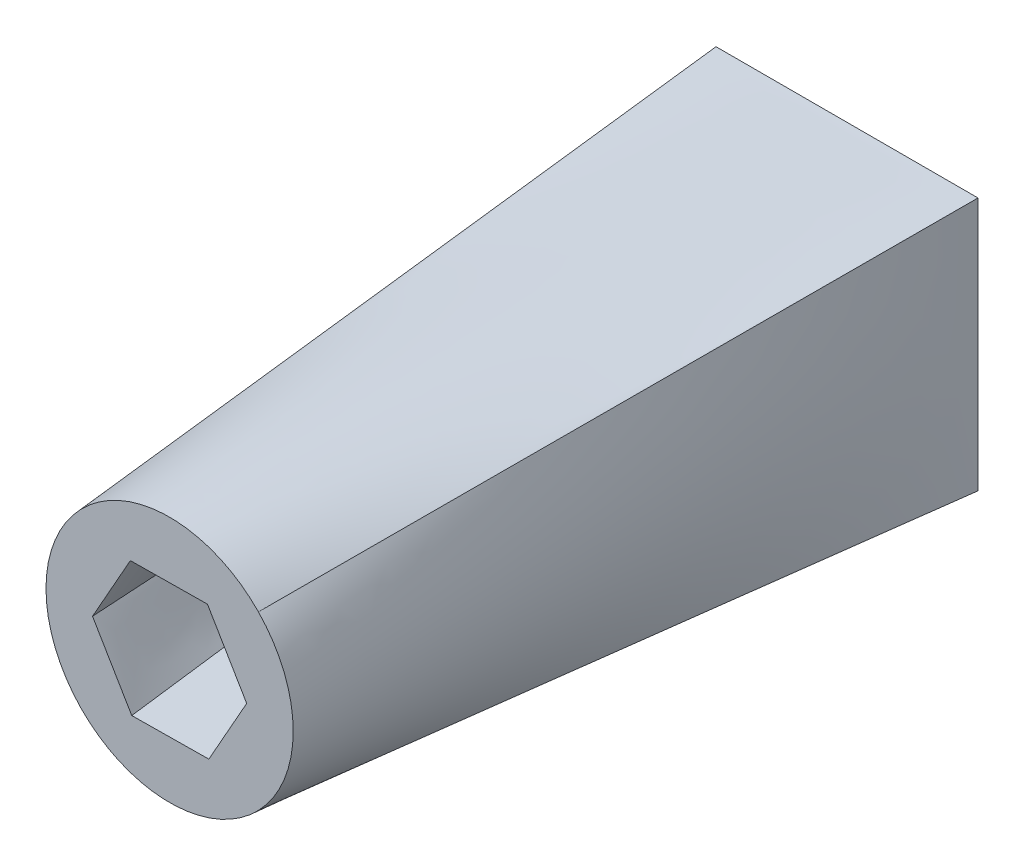
ISO-10303-21;
HEADER;
FILE_DESCRIPTION(('STEP AP214'),'2;1');
FILE_NAME('part.step','',(''),(''),'','','');
FILE_SCHEMA(('AUTOMOTIVE_DESIGN { 1 0 10303 214 1 1 1 1 }'));
ENDSEC;
DATA;
#1=APPLICATION_CONTEXT('core data for automotive mechanical design processes');
#2=APPLICATION_PROTOCOL_DEFINITION('international standard','automotive_design',2000,#1);
#3=PRODUCT_CONTEXT('',#1,'mechanical');
#4=PRODUCT('Part','Part','',(#3));
#5=PRODUCT_RELATED_PRODUCT_CATEGORY('part','',(#4));
#6=PRODUCT_DEFINITION_FORMATION('','',#4);
#7=PRODUCT_DEFINITION_CONTEXT('part definition',#1,'design');
#8=PRODUCT_DEFINITION('design','',#6,#7);
#9=PRODUCT_DEFINITION_SHAPE('','',#8);
#10=(LENGTH_UNIT() NAMED_UNIT(*) SI_UNIT(.MILLI.,.METRE.));
#11=(NAMED_UNIT(*) PLANE_ANGLE_UNIT() SI_UNIT($,.RADIAN.));
#12=(NAMED_UNIT(*) SI_UNIT($,.STERADIAN.) SOLID_ANGLE_UNIT());
#13=UNCERTAINTY_MEASURE_WITH_UNIT(LENGTH_MEASURE(1.E-05),#10,'distance_accuracy_value','');
#14=(GEOMETRIC_REPRESENTATION_CONTEXT(3) GLOBAL_UNCERTAINTY_ASSIGNED_CONTEXT((#13)) GLOBAL_UNIT_ASSIGNED_CONTEXT((#10,
#11,#12)) REPRESENTATION_CONTEXT('',''));
#15=CARTESIAN_POINT('',(0.,0.,0.));
#16=DIRECTION('',(0.,0.,1.));
#17=DIRECTION('',(1.,0.,0.));
#18=AXIS2_PLACEMENT_3D('',#15,#16,#17);
#19=CARTESIAN_POINT('',(0.,0.,200.));
#20=DIRECTION('',(0.,0.,1.));
#21=DIRECTION('',(1.,0.,0.));
#22=AXIS2_PLACEMENT_3D('',#19,#20,#21);
#23=PLANE('',#22);
#24=DIRECTION('',(-0.490964430670506,-0.871179618572649,0.));
#25=VECTOR('',#24,1.);
#26=CARTESIAN_POINT('',(-11.5843119242048,19.5911157541689,200.));
#27=LINE('',#26,#25);
#28=CARTESIAN_POINT('',(-11.5843119242048,19.5911157541689,200.));
#29=VERTEX_POINT('',#28);
#30=CARTESIAN_POINT('',(-22.7585598936942,-0.236750534639941,200.));
#31=VERTEX_POINT('',#30);
#32=EDGE_CURVE('E95',#29,#31,#27,.T.);
#33=ORIENTED_EDGE('',*,*,#32,.F.);
#34=DIRECTION('',(-0.999945896278404,-0.0104021399711025,0.));
#35=VECTOR('',#34,1.);
#36=CARTESIAN_POINT('',(11.1742479694894,19.8278662888088,200.));
#37=LINE('',#36,#35);
#38=CARTESIAN_POINT('',(11.1742479694894,19.8278662888088,200.));
#39=VERTEX_POINT('',#38);
#40=EDGE_CURVE('E193',#39,#29,#37,.T.);
#41=ORIENTED_EDGE('',*,*,#40,.F.);
#42=DIRECTION('',(-0.508981465607899,0.860777478601546,0.));
#43=VECTOR('',#42,1.);
#44=CARTESIAN_POINT('',(22.7585598936942,0.236750534639953,200.));
#45=LINE('',#44,#43);
#46=CARTESIAN_POINT('',(22.7585598936942,0.236750534639953,200.));
#47=VERTEX_POINT('',#46);
#48=EDGE_CURVE('E476',#47,#39,#45,.T.);
#49=ORIENTED_EDGE('',*,*,#48,.F.);
#50=DIRECTION('',(0.490964430670506,0.871179618572649,0.));
#51=VECTOR('',#50,1.);
#52=CARTESIAN_POINT('',(11.5843119242048,-19.5911157541689,200.));
#53=LINE('',#52,#51);
#54=CARTESIAN_POINT('',(11.5843119242048,-19.5911157541689,200.));
#55=VERTEX_POINT('',#54);
#56=EDGE_CURVE('E467',#55,#47,#53,.T.);
#57=ORIENTED_EDGE('',*,*,#56,.F.);
#58=DIRECTION('',(0.999945896278405,0.0104021399711027,0.));
#59=VECTOR('',#58,1.);
#60=CARTESIAN_POINT('',(-11.1742479694893,-19.8278662888088,200.));
#61=LINE('',#60,#59);
#62=CARTESIAN_POINT('',(-11.1742479694893,-19.8278662888088,200.));
#63=VERTEX_POINT('',#62);
#64=EDGE_CURVE('E199',#63,#55,#61,.T.);
#65=ORIENTED_EDGE('',*,*,#64,.F.);
#66=DIRECTION('',(0.508981465607898,-0.860777478601546,0.));
#67=VECTOR('',#66,1.);
#68=CARTESIAN_POINT('',(-22.7585598936942,-0.236750534639941,200.));
#69=LINE('',#68,#67);
#70=EDGE_CURVE('E173',#31,#63,#69,.T.);
#71=ORIENTED_EDGE('',*,*,#70,.F.);
#72=EDGE_LOOP('',(#33,#41,#49,#57,#65,#71));
#73=FACE_BOUND('',#72,.T.);
#74=CARTESIAN_POINT('',(0.,0.,200.));
#75=DIRECTION('',(0.,0.,1.));
#76=DIRECTION('',(1.,0.,0.));
#77=AXIS2_PLACEMENT_3D('',#74,#75,#76);
#78=CIRCLE('',#77,36.4946815327442);
#79=CARTESIAN_POINT('',(26.2199759183537,25.384535509191,200.));
#80=VERTEX_POINT('',#79);
#81=CARTESIAN_POINT('',(-26.2199759183537,25.3845355091909,200.));
#82=VERTEX_POINT('',#81);
#83=EDGE_CURVE('E12',#80,#82,#78,.T.);
#84=ORIENTED_EDGE('',*,*,#83,.T.);
#85=CARTESIAN_POINT('',(-26.2199759183537,-25.3845355091909,200.));
#86=VERTEX_POINT('',#85);
#87=EDGE_CURVE('E102',#82,#86,#78,.T.);
#88=ORIENTED_EDGE('',*,*,#87,.T.);
#89=CARTESIAN_POINT('',(26.2199759183537,-25.3845355091909,200.));
#90=VERTEX_POINT('',#89);
#91=EDGE_CURVE('E322',#86,#90,#78,.T.);
#92=ORIENTED_EDGE('',*,*,#91,.T.);
#93=EDGE_CURVE('E339',#90,#80,#78,.T.);
#94=ORIENTED_EDGE('',*,*,#93,.T.);
#95=EDGE_LOOP('',(#84,#88,#92,#94));
#96=FACE_BOUND('',#95,.T.);
#97=ADVANCED_FACE('F91',(#73,#96),#23,.T.);
#98=CARTESIAN_POINT('',(0.,0.,0.));
#99=DIRECTION('',(0.,0.,1.));
#100=DIRECTION('',(1.,0.,0.));
#101=AXIS2_PLACEMENT_3D('',#98,#99,#100);
#102=PLANE('',#101);
#103=DIRECTION('',(1.,0.,0.));
#104=VECTOR('',#103,1.);
#105=CARTESIAN_POINT('',(25.4400575590377,8.80180562868562,0.));
#106=LINE('',#105,#104);
#107=CARTESIAN_POINT('',(-0.397500899359964,8.80180562868562,0.));
#108=VERTEX_POINT('',#107);
#109=CARTESIAN_POINT('',(25.4400575590377,8.80180562868562,0.));
#110=VERTEX_POINT('',#109);
#111=EDGE_CURVE('E255',#108,#110,#106,.T.);
#112=ORIENTED_EDGE('',*,*,#111,.F.);
#113=CARTESIAN_POINT('',(-26.2350593577576,8.80180562868562,0.));
#114=VERTEX_POINT('',#113);
#115=EDGE_CURVE('E448',#114,#108,#106,.T.);
#116=ORIENTED_EDGE('',*,*,#115,.F.);
#117=CARTESIAN_POINT('',(-26.2350593577576,0.,0.));
#118=DIRECTION('',(0.,0.,-1.));
#119=DIRECTION('',(-1.,0.,0.));
#120=AXIS2_PLACEMENT_3D('',#117,#118,#119);
#121=CIRCLE('',#120,8.80180562868562);
#122=CARTESIAN_POINT('',(-26.2350593577576,-8.80180562868562,0.));
#123=VERTEX_POINT('',#122);
#124=EDGE_CURVE('E177',#123,#114,#121,.T.);
#125=ORIENTED_EDGE('',*,*,#124,.F.);
#126=DIRECTION('',(-1.,0.,0.));
#127=VECTOR('',#126,1.);
#128=CARTESIAN_POINT('',(25.4400575590377,-8.80180562868562,0.));
#129=LINE('',#128,#127);
#130=CARTESIAN_POINT('',(-0.397500899359988,-8.80180562868562,0.));
#131=VERTEX_POINT('',#130);
#132=EDGE_CURVE('E228',#131,#123,#129,.T.);
#133=ORIENTED_EDGE('',*,*,#132,.F.);
#134=CARTESIAN_POINT('',(25.4400575590377,-8.80180562868562,0.));
#135=VERTEX_POINT('',#134);
#136=EDGE_CURVE('E237',#135,#131,#129,.T.);
#137=ORIENTED_EDGE('',*,*,#136,.F.);
#138=CARTESIAN_POINT('',(25.4400575590377,0.,0.));
#139=DIRECTION('',(0.,0.,-1.));
#140=DIRECTION('',(-1.,0.,0.));
#141=AXIS2_PLACEMENT_3D('',#138,#139,#140);
#142=CIRCLE('',#141,8.80180562868562);
#143=EDGE_CURVE('E238',#110,#135,#142,.T.);
#144=ORIENTED_EDGE('',*,*,#143,.F.);
#145=EDGE_LOOP('',(#112,#116,#125,#133,#137,#144));
#146=FACE_BOUND('',#145,.T.);
#147=DIRECTION('',(0.,1.,0.));
#148=VECTOR('',#147,1.);
#149=CARTESIAN_POINT('',(38.674883286648,37.4425953387898,0.));
#150=LINE('',#149,#148);
#151=CARTESIAN_POINT('',(38.674883286648,-37.4425953387898,0.));
#152=VERTEX_POINT('',#151);
#153=CARTESIAN_POINT('',(38.674883286648,37.4425953387898,0.));
#154=VERTEX_POINT('',#153);
#155=EDGE_CURVE('E635',#152,#154,#150,.T.);
#156=ORIENTED_EDGE('',*,*,#155,.F.);
#157=DIRECTION('',(1.,0.,0.));
#158=VECTOR('',#157,1.);
#159=CARTESIAN_POINT('',(-38.674883286648,-37.4425953387898,0.));
#160=LINE('',#159,#158);
#161=CARTESIAN_POINT('',(-38.674883286648,-37.4425953387898,0.));
#162=VERTEX_POINT('',#161);
#163=EDGE_CURVE('E638',#162,#152,#160,.T.);
#164=ORIENTED_EDGE('',*,*,#163,.F.);
#165=DIRECTION('',(0.,-1.,0.));
#166=VECTOR('',#165,1.);
#167=CARTESIAN_POINT('',(-38.674883286648,37.4425953387898,0.));
#168=LINE('',#167,#166);
#169=CARTESIAN_POINT('',(-38.674883286648,37.4425953387898,0.));
#170=VERTEX_POINT('',#169);
#171=EDGE_CURVE('E640',#170,#162,#168,.T.);
#172=ORIENTED_EDGE('',*,*,#171,.F.);
#173=DIRECTION('',(-1.,0.,0.));
#174=VECTOR('',#173,1.);
#175=CARTESIAN_POINT('',(-38.674883286648,37.4425953387898,0.));
#176=LINE('',#175,#174);
#177=EDGE_CURVE('E271',#154,#170,#176,.T.);
#178=ORIENTED_EDGE('',*,*,#177,.F.);
#179=EDGE_LOOP('',(#156,#164,#172,#178));
#180=FACE_BOUND('',#179,.T.);
#181=ADVANCED_FACE('F382',(#146,#180),#102,.F.);
#182=CARTESIAN_POINT('',(-38.674883286648,37.4425953387898,0.));
#183=CARTESIAN_POINT('',(-26.2199759183537,25.3845355091909,200.));
#184=CARTESIAN_POINT('',(-38.674883286648,34.3223790605573,0.));
#185=CARTESIAN_POINT('',(-27.6913653006651,23.8647206535377,200.));
#186=CARTESIAN_POINT('',(-38.674883286648,31.2021627823248,0.));
#187=CARTESIAN_POINT('',(-29.082713953847,22.1616556356841,200.));
#188=CARTESIAN_POINT('',(-38.674883286648,24.9617302258599,0.));
#189=CARTESIAN_POINT('',(-31.5890003174961,18.4140785915877,200.));
#190=CARTESIAN_POINT('',(-38.674883286648,21.8415139476274,0.));
#191=CARTESIAN_POINT('',(-32.7031713151876,16.3694213020386,200.));
#192=CARTESIAN_POINT('',(-38.674883286648,15.6010813911625,0.));
#193=CARTESIAN_POINT('',(-34.5424270388589,12.0114987449215,200.));
#194=CARTESIAN_POINT('',(-38.674883286648,12.48086511293,0.));
#195=CARTESIAN_POINT('',(-35.2666769915234,9.69856716025703,200.));
#196=CARTESIAN_POINT('',(-38.674883286648,6.24043255646502,0.));
#197=CARTESIAN_POINT('',(-36.2430818637852,4.92338582699144,200.));
#198=CARTESIAN_POINT('',(-38.674883286648,3.12021627823253,0.));
#199=CARTESIAN_POINT('',(-36.4946815327442,2.46194583774648,200.));
#200=CARTESIAN_POINT('',(-38.674883286648,-3.12021627823244,0.));
#201=CARTESIAN_POINT('',(-36.4946815327442,-2.46194583774648,200.));
#202=CARTESIAN_POINT('',(-38.674883286648,-6.24043255646492,0.));
#203=CARTESIAN_POINT('',(-36.2430818637852,-4.92338582699143,200.));
#204=CARTESIAN_POINT('',(-38.674883286648,-12.4808651129299,0.));
#205=CARTESIAN_POINT('',(-35.2666769915234,-9.69856716025703,200.));
#206=CARTESIAN_POINT('',(-38.674883286648,-15.6010813911624,0.));
#207=CARTESIAN_POINT('',(-34.5424270388589,-12.0114987449215,200.));
#208=CARTESIAN_POINT('',(-38.674883286648,-21.8415139476273,0.));
#209=CARTESIAN_POINT('',(-32.7031713151876,-16.3694213020386,200.));
#210=CARTESIAN_POINT('',(-38.674883286648,-24.9617302258598,0.));
#211=CARTESIAN_POINT('',(-31.5890003174961,-18.4140785915877,200.));
#212=CARTESIAN_POINT('',(-38.674883286648,-31.2021627823248,0.));
#213=CARTESIAN_POINT('',(-29.082713953847,-22.1616556356841,200.));
#214=CARTESIAN_POINT('',(-38.674883286648,-34.3223790605573,0.));
#215=CARTESIAN_POINT('',(-27.6913653006651,-23.8647206535377,200.));
#216=CARTESIAN_POINT('',(-38.674883286648,-37.4425953387898,0.));
#217=CARTESIAN_POINT('',(-26.2199759183537,-25.3845355091909,200.));
#218=B_SPLINE_SURFACE_WITH_KNOTS('',3,1,((#182,#183),(#184,#185),(#186,#187),(#188,#189),(#190,
#191),(#192,#193),(#194,#195),(#196,#197),(#198,#199),(#200,#201),(#202,#203),(#204,#205),(#206,
#207),(#208,#209),(#210,#211),(#212,#213),(#214,#215),(#216,#217)),.UNSPECIFIED.,.F.,.F.,.F.,(4,
2,2,2,2,2,2,2,4),(2,2),(0.,0.125,0.25,0.375,0.5,0.625,0.75,0.875,1.),(0.,1.),.UNSPECIFIED.);
#219=DIRECTION('',(0.0620419113328122,0.0600650857266208,0.996264516438694));
#220=VECTOR('',#219,1.);
#221=CARTESIAN_POINT('',(-32.4474296025008,-31.4135654239904,100.));
#222=LINE('',#221,#220);
#223=EDGE_CURVE('E646',#162,#86,#222,.T.);
#224=DIRECTION('',(-0.0620419113328122,0.0600650857266208,-0.996264516438694));
#225=VECTOR('',#224,1.);
#226=CARTESIAN_POINT('',(-32.4474296025008,31.4135654239904,100.));
#227=LINE('',#226,#225);
#228=EDGE_CURVE('E643',#82,#170,#227,.T.);
#229=ORIENTED_EDGE('',*,*,#171,.T.);
#230=ORIENTED_EDGE('',*,*,#223,.T.);
#231=ORIENTED_EDGE('',*,*,#87,.F.);
#232=ORIENTED_EDGE('',*,*,#228,.T.);
#233=EDGE_LOOP('',(#229,#230,#231,#232));
#234=FACE_BOUND('',#233,.T.);
#235=ADVANCED_FACE('F391',(#234),#218,.T.);
#236=CARTESIAN_POINT('',(-38.674883286648,-37.4425953387898,0.));
#237=CARTESIAN_POINT('',(-26.2199759183537,-25.3845355091909,200.));
#238=CARTESIAN_POINT('',(-35.451976346094,-37.4425953387898,0.));
#239=CARTESIAN_POINT('',(-24.7001610627005,-26.9543695879416,200.));
#240=CARTESIAN_POINT('',(-32.22906940554,-37.4425953387898,0.));
#241=CARTESIAN_POINT('',(-22.9794220376688,-28.4479823663771,200.));
#242=CARTESIAN_POINT('',(-25.783255524432,-37.4425953387898,0.));
#243=CARTESIAN_POINT('',(-19.1565661839337,-31.1507224626262,200.));
#244=CARTESIAN_POINT('',(-22.560348583878,-37.4425953387898,0.));
#245=CARTESIAN_POINT('',(-17.0541999472398,-32.3589261828028,200.));
#246=CARTESIAN_POINT('',(-16.11453470277,-37.4425953387898,0.));
#247=CARTESIAN_POINT('',(-12.5448633657296,-34.3594563792807,200.));
#248=CARTESIAN_POINT('',(-12.891627762216,-37.4425953387898,0.));
#249=CARTESIAN_POINT('',(-10.1382512066798,-35.1507259768581,200.));
#250=CARTESIAN_POINT('',(-6.44581388110797,-37.4425953387898,0.));
#251=CARTESIAN_POINT('',(-5.15397511670574,-36.2186997934256,200.));
#252=CARTESIAN_POINT('',(-3.22290694055397,-37.4425953387898,0.));
#253=CARTESIAN_POINT('',(-2.57730494092512,-36.4946815327442,200.));
#254=CARTESIAN_POINT('',(3.22290694055402,-37.4425953387898,0.));
#255=CARTESIAN_POINT('',(2.57730494092509,-36.4946815327442,200.));
#256=CARTESIAN_POINT('',(6.44581388110802,-37.4425953387898,0.));
#257=CARTESIAN_POINT('',(5.15397511670571,-36.2186997934257,200.));
#258=CARTESIAN_POINT('',(12.891627762216,-37.4425953387898,0.));
#259=CARTESIAN_POINT('',(10.1382512066797,-35.1507259768581,200.));
#260=CARTESIAN_POINT('',(16.11453470277,-37.4425953387898,0.));
#261=CARTESIAN_POINT('',(12.5448633657296,-34.3594563792807,200.));
#262=CARTESIAN_POINT('',(22.560348583878,-37.4425953387898,0.));
#263=CARTESIAN_POINT('',(17.0541999472397,-32.3589261828028,200.));
#264=CARTESIAN_POINT('',(25.783255524432,-37.4425953387898,0.));
#265=CARTESIAN_POINT('',(19.1565661839337,-31.1507224626262,200.));
#266=CARTESIAN_POINT('',(32.22906940554,-37.4425953387898,0.));
#267=CARTESIAN_POINT('',(22.9794220376687,-28.4479823663771,200.));
#268=CARTESIAN_POINT('',(35.451976346094,-37.4425953387898,0.));
#269=CARTESIAN_POINT('',(24.7001610627004,-26.9543695879416,200.));
#270=CARTESIAN_POINT('',(38.674883286648,-37.4425953387898,0.));
#271=CARTESIAN_POINT('',(26.2199759183537,-25.3845355091909,200.));
#272=B_SPLINE_SURFACE_WITH_KNOTS('',3,1,((#236,#237),(#238,#239),(#240,#241),(#242,#243),(#244,
#245),(#246,#247),(#248,#249),(#250,#251),(#252,#253),(#254,#255),(#256,#257),(#258,#259),(#260,
#261),(#262,#263),(#264,#265),(#266,#267),(#268,#269),(#270,#271)),.UNSPECIFIED.,.F.,.F.,.F.,(4,
2,2,2,2,2,2,2,4),(2,2),(0.,0.125,0.25,0.375,0.5,0.625,0.75,0.875,1.),(0.,1.),.UNSPECIFIED.);
#273=DIRECTION('',(-0.0620419113328122,0.0600650857266208,0.996264516438694));
#274=VECTOR('',#273,1.);
#275=CARTESIAN_POINT('',(32.4474296025008,-31.4135654239904,100.));
#276=LINE('',#275,#274);
#277=EDGE_CURVE('E649',#152,#90,#276,.T.);
#278=ORIENTED_EDGE('',*,*,#163,.T.);
#279=ORIENTED_EDGE('',*,*,#277,.T.);
#280=ORIENTED_EDGE('',*,*,#91,.F.);
#281=ORIENTED_EDGE('',*,*,#223,.F.);
#282=EDGE_LOOP('',(#278,#279,#280,#281));
#283=FACE_BOUND('',#282,.T.);
#284=ADVANCED_FACE('F291',(#283),#272,.T.);
#285=CARTESIAN_POINT('',(38.674883286648,37.4425953387898,0.));
#286=CARTESIAN_POINT('',(26.2199759183537,25.3845355091909,200.));
#287=CARTESIAN_POINT('',(35.451976346094,37.4425953387898,0.));
#288=CARTESIAN_POINT('',(24.7001610627005,26.9543695879416,200.));
#289=CARTESIAN_POINT('',(32.22906940554,37.4425953387898,0.));
#290=CARTESIAN_POINT('',(22.9794220376688,28.4479823663771,200.));
#291=CARTESIAN_POINT('',(25.783255524432,37.4425953387898,0.));
#292=CARTESIAN_POINT('',(19.1565661839337,31.1507224626262,200.));
#293=CARTESIAN_POINT('',(22.560348583878,37.4425953387898,0.));
#294=CARTESIAN_POINT('',(17.0541999472398,32.3589261828028,200.));
#295=CARTESIAN_POINT('',(16.11453470277,37.4425953387898,0.));
#296=CARTESIAN_POINT('',(12.5448633657296,34.3594563792807,200.));
#297=CARTESIAN_POINT('',(12.891627762216,37.4425953387898,0.));
#298=CARTESIAN_POINT('',(10.1382512066797,35.1507259768581,200.));
#299=CARTESIAN_POINT('',(6.44581388110797,37.4425953387898,0.));
#300=CARTESIAN_POINT('',(5.15397511670572,36.2186997934257,200.));
#301=CARTESIAN_POINT('',(3.22290694055398,37.4425953387898,0.));
#302=CARTESIAN_POINT('',(2.57730494092511,36.4946815327442,200.));
#303=CARTESIAN_POINT('',(-3.22290694055402,37.4425953387898,0.));
#304=CARTESIAN_POINT('',(-2.57730494092512,36.4946815327442,200.));
#305=CARTESIAN_POINT('',(-6.44581388110802,37.4425953387898,0.));
#306=CARTESIAN_POINT('',(-5.15397511670573,36.2186997934257,200.));
#307=CARTESIAN_POINT('',(-12.891627762216,37.4425953387898,0.));
#308=CARTESIAN_POINT('',(-10.1382512066797,35.1507259768581,200.));
#309=CARTESIAN_POINT('',(-16.11453470277,37.4425953387898,0.));
#310=CARTESIAN_POINT('',(-12.5448633657296,34.3594563792807,200.));
#311=CARTESIAN_POINT('',(-22.560348583878,37.4425953387898,0.));
#312=CARTESIAN_POINT('',(-17.0541999472398,32.3589261828028,200.));
#313=CARTESIAN_POINT('',(-25.783255524432,37.4425953387898,0.));
#314=CARTESIAN_POINT('',(-19.1565661839337,31.1507224626262,200.));
#315=CARTESIAN_POINT('',(-32.22906940554,37.4425953387898,0.));
#316=CARTESIAN_POINT('',(-22.9794220376688,28.4479823663771,200.));
#317=CARTESIAN_POINT('',(-35.451976346094,37.4425953387898,0.));
#318=CARTESIAN_POINT('',(-24.7001610627005,26.9543695879416,200.));
#319=CARTESIAN_POINT('',(-38.674883286648,37.4425953387898,0.));
#320=CARTESIAN_POINT('',(-26.2199759183537,25.3845355091909,200.));
#321=B_SPLINE_SURFACE_WITH_KNOTS('',3,1,((#285,#286),(#287,#288),(#289,#290),(#291,#292),(#293,
#294),(#295,#296),(#297,#298),(#299,#300),(#301,#302),(#303,#304),(#305,#306),(#307,#308),(#309,
#310),(#311,#312),(#313,#314),(#315,#316),(#317,#318),(#319,#320)),.UNSPECIFIED.,.F.,.F.,.F.,(4,
2,2,2,2,2,2,2,4),(2,2),(0.,0.125,0.25,0.375,0.5,0.625,0.75,0.875,1.),(0.,1.),.UNSPECIFIED.);
#322=DIRECTION('',(-0.0620419113328122,-0.0600650857266207,0.996264516438694));
#323=VECTOR('',#322,1.);
#324=CARTESIAN_POINT('',(32.4474296025008,31.4135654239904,100.));
#325=LINE('',#324,#323);
#326=EDGE_CURVE('E277',#154,#80,#325,.T.);
#327=ORIENTED_EDGE('',*,*,#177,.T.);
#328=ORIENTED_EDGE('',*,*,#228,.F.);
#329=ORIENTED_EDGE('',*,*,#83,.F.);
#330=ORIENTED_EDGE('',*,*,#326,.F.);
#331=EDGE_LOOP('',(#327,#328,#329,#330));
#332=FACE_BOUND('',#331,.T.);
#333=ADVANCED_FACE('F279',(#332),#321,.T.);
#334=CARTESIAN_POINT('',(38.674883286648,-37.4425953387898,0.));
#335=CARTESIAN_POINT('',(26.2199759183537,-25.384535509191,200.));
#336=CARTESIAN_POINT('',(38.674883286648,-34.3223790605573,0.));
#337=CARTESIAN_POINT('',(27.6913653006651,-23.8647206535377,200.));
#338=CARTESIAN_POINT('',(38.674883286648,-31.2021627823249,0.));
#339=CARTESIAN_POINT('',(29.082713953847,-22.1616556356841,200.));
#340=CARTESIAN_POINT('',(38.674883286648,-24.9617302258599,0.));
#341=CARTESIAN_POINT('',(31.5890003174961,-18.4140785915877,200.));
#342=CARTESIAN_POINT('',(38.674883286648,-21.8415139476274,0.));
#343=CARTESIAN_POINT('',(32.7031713151876,-16.3694213020386,200.));
#344=CARTESIAN_POINT('',(38.674883286648,-15.6010813911625,0.));
#345=CARTESIAN_POINT('',(34.5424270388589,-12.0114987449216,200.));
#346=CARTESIAN_POINT('',(38.674883286648,-12.48086511293,0.));
#347=CARTESIAN_POINT('',(35.2666769915234,-9.69856716025705,200.));
#348=CARTESIAN_POINT('',(38.674883286648,-6.24043255646501,0.));
#349=CARTESIAN_POINT('',(36.2430818637852,-4.92338582699145,200.));
#350=CARTESIAN_POINT('',(38.674883286648,-3.12021627823253,0.));
#351=CARTESIAN_POINT('',(36.4946815327442,-2.46194583774649,200.));
#352=CARTESIAN_POINT('',(38.674883286648,3.12021627823244,0.));
#353=CARTESIAN_POINT('',(36.4946815327442,2.46194583774648,200.));
#354=CARTESIAN_POINT('',(38.674883286648,6.24043255646493,0.));
#355=CARTESIAN_POINT('',(36.2430818637853,4.92338582699144,200.));
#356=CARTESIAN_POINT('',(38.674883286648,12.4808651129299,0.));
#357=CARTESIAN_POINT('',(35.2666769915234,9.69856716025704,200.));
#358=CARTESIAN_POINT('',(38.674883286648,15.6010813911624,0.));
#359=CARTESIAN_POINT('',(34.5424270388589,12.0114987449216,200.));
#360=CARTESIAN_POINT('',(38.674883286648,21.8415139476274,0.));
#361=CARTESIAN_POINT('',(32.7031713151876,16.3694213020386,200.));
#362=CARTESIAN_POINT('',(38.674883286648,24.9617302258598,0.));
#363=CARTESIAN_POINT('',(31.5890003174961,18.4140785915877,200.));
#364=CARTESIAN_POINT('',(38.674883286648,31.2021627823248,0.));
#365=CARTESIAN_POINT('',(29.082713953847,22.1616556356841,200.));
#366=CARTESIAN_POINT('',(38.674883286648,34.3223790605573,0.));
#367=CARTESIAN_POINT('',(27.6913653006651,23.8647206535377,200.));
#368=CARTESIAN_POINT('',(38.674883286648,37.4425953387898,0.));
#369=CARTESIAN_POINT('',(26.2199759183537,25.384535509191,200.));
#370=B_SPLINE_SURFACE_WITH_KNOTS('',3,1,((#334,#335),(#336,#337),(#338,#339),(#340,#341),(#342,
#343),(#344,#345),(#346,#347),(#348,#349),(#350,#351),(#352,#353),(#354,#355),(#356,#357),(#358,
#359),(#360,#361),(#362,#363),(#364,#365),(#366,#367),(#368,#369)),.UNSPECIFIED.,.F.,.F.,.F.,(4,
2,2,2,2,2,2,2,4),(2,2),(0.,0.125,0.25,0.375,0.5,0.625,0.75,0.875,1.),(0.,1.),.UNSPECIFIED.);
#371=ORIENTED_EDGE('',*,*,#155,.T.);
#372=ORIENTED_EDGE('',*,*,#326,.T.);
#373=ORIENTED_EDGE('',*,*,#93,.F.);
#374=ORIENTED_EDGE('',*,*,#277,.F.);
#375=EDGE_LOOP('',(#371,#372,#373,#374));
#376=FACE_BOUND('',#375,.T.);
#377=ADVANCED_FACE('F290',(#376),#370,.T.);
#378=CARTESIAN_POINT('',(-22.7585598936942,-0.236750534639941,200.));
#379=CARTESIAN_POINT('',(-26.2350593577576,8.80180562868562,0.));
#380=CARTESIAN_POINT('',(-20.8961852321126,3.06789384682819,200.));
#381=CARTESIAN_POINT('',(-21.9287996146914,8.80180562868562,0.));
#382=CARTESIAN_POINT('',(-19.0338105705311,6.37253822829633,200.));
#383=CARTESIAN_POINT('',(-17.6225398716251,8.80180562868562,0.));
#384=CARTESIAN_POINT('',(-15.3090612473679,12.9818269912326,200.));
#385=CARTESIAN_POINT('',(-9.01002038549252,8.80180562868562,0.));
#386=CARTESIAN_POINT('',(-13.4466865857864,16.2864713727007,200.));
#387=CARTESIAN_POINT('',(-4.70376064242624,8.80180562868562,0.));
#388=CARTESIAN_POINT('',(-11.5843119242048,19.5911157541689,200.));
#389=CARTESIAN_POINT('',(-0.397500899359964,8.80180562868562,0.));
#390=B_SPLINE_SURFACE_WITH_KNOTS('',3,1,((#378,#379),(#380,#381),(#382,#383),(#384,#385),(#386,
#387),(#388,#389)),.UNSPECIFIED.,.F.,.F.,.F.,(4,2,4),(2,2),(0.,0.5,1.),(0.,1.),.UNSPECIFIED.);
#391=DIRECTION('',(0.0173621561129878,-0.0451398956812271,0.99882978797841));
#392=VECTOR('',#391,1.);
#393=CARTESIAN_POINT('',(-24.4968096257259,4.28252754702284,100.));
#394=LINE('',#393,#392);
#395=EDGE_CURVE('E169',#114,#31,#394,.T.);
#396=DIRECTION('',(0.0557659275627196,-0.0537843971417011,-0.996994182504177));
#397=VECTOR('',#396,1.);
#398=CARTESIAN_POINT('',(-5.9909064117824,14.1964606914272,100.));
#399=LINE('',#398,#397);
#400=EDGE_CURVE('E182',#29,#108,#399,.T.);
#401=ORIENTED_EDGE('',*,*,#32,.T.);
#402=ORIENTED_EDGE('',*,*,#395,.F.);
#403=ORIENTED_EDGE('',*,*,#115,.T.);
#404=ORIENTED_EDGE('',*,*,#400,.F.);
#405=EDGE_LOOP('',(#401,#402,#403,#404));
#406=FACE_BOUND('',#405,.T.);
#407=ADVANCED_FACE('F186',(#406),#390,.F.);
#408=CARTESIAN_POINT('',(-11.5843119242048,19.5911157541689,200.));
#409=CARTESIAN_POINT('',(-0.397500899359964,8.80180562868562,0.));
#410=CARTESIAN_POINT('',(-7.79121860858915,19.6305741766089,200.));
#411=CARTESIAN_POINT('',(3.90875884370631,8.80180562868562,0.));
#412=CARTESIAN_POINT('',(-3.99812529297346,19.6700325990489,200.));
#413=CARTESIAN_POINT('',(8.21501858677259,8.80180562868562,0.));
#414=CARTESIAN_POINT('',(3.58806133825794,19.7489494439288,200.));
#415=CARTESIAN_POINT('',(16.8275380729052,8.80180562868562,0.));
#416=CARTESIAN_POINT('',(7.38115465387365,19.7884078663688,200.));
#417=CARTESIAN_POINT('',(21.1337978159714,8.80180562868562,0.));
#418=CARTESIAN_POINT('',(11.1742479694894,19.8278662888088,200.));
#419=CARTESIAN_POINT('',(25.4400575590377,8.80180562868562,0.));
#420=B_SPLINE_SURFACE_WITH_KNOTS('',3,1,((#408,#409),(#410,#411),(#412,#413),(#414,#415),(#416,
#417),(#418,#419)),.UNSPECIFIED.,.F.,.F.,.F.,(4,2,4),(2,2),(0.,0.5,1.),(0.,1.),.UNSPECIFIED.);
#421=DIRECTION('',(0.0710409506995786,-0.0549076326057407,-0.995961010886136));
#422=VECTOR('',#421,1.);
#423=CARTESIAN_POINT('',(18.3071527642635,14.3148359587472,100.));
#424=LINE('',#423,#422);
#425=EDGE_CURVE('E547',#39,#110,#424,.T.);
#426=ORIENTED_EDGE('',*,*,#40,.T.);
#427=ORIENTED_EDGE('',*,*,#400,.T.);
#428=ORIENTED_EDGE('',*,*,#111,.T.);
#429=ORIENTED_EDGE('',*,*,#425,.F.);
#430=EDGE_LOOP('',(#426,#427,#428,#429));
#431=FACE_BOUND('',#430,.T.);
#432=ADVANCED_FACE('F516',(#431),#420,.F.);
#433=CARTESIAN_POINT('',(-11.1742479694894,-19.8278662888088,200.));
#434=CARTESIAN_POINT('',(-26.2350593577576,-8.80180562868562,0.));
#435=CARTESIAN_POINT('',(-11.4155878012436,-19.4197180439303,200.));
#436=CARTESIAN_POINT('',(-26.6018012589529,-8.80180562868563,0.));
#437=CARTESIAN_POINT('',(-11.6569276329979,-19.0115697990518,200.));
#438=CARTESIAN_POINT('',(-26.9916925040563,-8.77905838256246,0.));
#439=CARTESIAN_POINT('',(-12.1396072965064,-18.1952733092947,200.));
#440=CARTESIAN_POINT('',(-27.8151887677472,-8.66876870438956,0.));
#441=CARTESIAN_POINT('',(-12.3809471282607,-17.7871250644162,200.));
#442=CARTESIAN_POINT('',(-28.2489124856009,-8.58117370092658,0.));
#443=CARTESIAN_POINT('',(-12.8636267917692,-16.9708285746592,200.));
#444=CARTESIAN_POINT('',(-29.1502173819783,-8.31829310614983,0.));
#445=CARTESIAN_POINT('',(-13.1049666235235,-16.5626803297806,200.));
#446=CARTESIAN_POINT('',(-29.6179188791475,-8.14286474523523,0.));
#447=CARTESIAN_POINT('',(-13.587646287032,-15.7463838400236,200.));
#448=CARTESIAN_POINT('',(-30.5661418480249,-7.68060604790747,0.));
#449=CARTESIAN_POINT('',(-13.8289861187863,-15.3382355951451,200.));
#450=CARTESIAN_POINT('',(-31.0467131014391,-7.39351672809592,0.));
#451=CARTESIAN_POINT('',(-14.3116657822949,-14.521939105388,200.));
#452=CARTESIAN_POINT('',(-31.9855723684989,-6.68937227780108,0.));
#453=CARTESIAN_POINT('',(-14.5530056140491,-14.1137908605095,200.));
#454=CARTESIAN_POINT('',(-32.4437265295027,-6.27198159266821,0.));
#455=CARTESIAN_POINT('',(-15.0356852775577,-13.2974943707525,200.));
#456=CARTESIAN_POINT('',(-33.2893869689636,-5.30299567245261,0.));
#457=CARTESIAN_POINT('',(-15.2770251093119,-12.889346125874,200.));
#458=CARTESIAN_POINT('',(-33.6764936436015,-4.75114767499985,0.));
#459=CARTESIAN_POINT('',(-15.7597047728205,-12.0730496361169,200.));
#460=CARTESIAN_POINT('',(-34.3262232401826,-3.53290468141015,0.));
#461=CARTESIAN_POINT('',(-16.0010446045747,-11.6649013912384,200.));
#462=CARTESIAN_POINT('',(-34.5882680289576,-2.86657622368555,0.));
#463=CARTESIAN_POINT('',(-16.4837242680833,-10.8486049014814,200.));
#464=CARTESIAN_POINT('',(-34.9438123667791,-1.46662039351354,0.));
#465=CARTESIAN_POINT('',(-16.7250640998375,-10.4404566566028,200.));
#466=CARTESIAN_POINT('',(-35.0368649864433,-0.73348380239047,0.));
#467=CARTESIAN_POINT('',(-17.2077437633461,-9.62416016684582,200.));
#468=CARTESIAN_POINT('',(-35.0368649864433,0.733483802390468,0.));
#469=CARTESIAN_POINT('',(-17.4490835951003,-9.2160119219673,200.));
#470=CARTESIAN_POINT('',(-34.9438123667791,1.46662039351353,0.));
#471=CARTESIAN_POINT('',(-17.9317632586089,-8.39971543221027,200.));
#472=CARTESIAN_POINT('',(-34.5882680289576,2.86657622368554,0.));
#473=CARTESIAN_POINT('',(-18.1731030903631,-7.99156718733175,200.));
#474=CARTESIAN_POINT('',(-34.3262232401826,3.53290468141015,0.));
#475=CARTESIAN_POINT('',(-18.6557827538717,-7.17527069757472,200.));
#476=CARTESIAN_POINT('',(-33.6764936436014,4.75114767499985,0.));
#477=CARTESIAN_POINT('',(-18.8971225856259,-6.76712245269621,200.));
#478=CARTESIAN_POINT('',(-33.2893869689636,5.30299567245261,0.));
#479=CARTESIAN_POINT('',(-19.3798022491344,-5.95082596293917,200.));
#480=CARTESIAN_POINT('',(-32.4437265295027,6.2719815926682,0.));
#481=CARTESIAN_POINT('',(-19.6211420808887,-5.54267771806066,200.));
#482=CARTESIAN_POINT('',(-31.9855723684989,6.68937227780107,0.));
#483=CARTESIAN_POINT('',(-20.1038217443972,-4.72638122830362,200.));
#484=CARTESIAN_POINT('',(-31.0467131014391,7.39351672809593,0.));
#485=CARTESIAN_POINT('',(-20.3451615761515,-4.31823298342511,200.));
#486=CARTESIAN_POINT('',(-30.5661418480249,7.68060604790747,0.));
#487=CARTESIAN_POINT('',(-20.8278412396601,-3.50193649366807,200.));
#488=CARTESIAN_POINT('',(-29.6179188791474,8.14286474523523,0.));
#489=CARTESIAN_POINT('',(-21.0691810714143,-3.09378824878955,200.));
#490=CARTESIAN_POINT('',(-29.1502173819783,8.31829310614983,0.));
#491=CARTESIAN_POINT('',(-21.5518607349229,-2.27749175903252,200.));
#492=CARTESIAN_POINT('',(-28.2489124856009,8.58117370092657,0.));
#493=CARTESIAN_POINT('',(-21.7932005666771,-1.869343514154,200.));
#494=CARTESIAN_POINT('',(-27.8151887677472,8.66876870438956,0.));
#495=CARTESIAN_POINT('',(-22.2758802301857,-1.05304702439697,200.));
#496=CARTESIAN_POINT('',(-26.9916925040563,8.77905838256246,0.));
#497=CARTESIAN_POINT('',(-22.5172200619399,-0.644898779518456,200.));
#498=CARTESIAN_POINT('',(-26.6018012589529,8.80180562868562,0.));
#499=CARTESIAN_POINT('',(-22.7585598936942,-0.236750534639941,200.));
#500=CARTESIAN_POINT('',(-26.2350593577576,8.80180562868562,0.));
#501=B_SPLINE_SURFACE_WITH_KNOTS('',3,1,((#433,#434),(#435,#436),(#437,#438),(#439,#440),(#441,
#442),(#443,#444),(#445,#446),(#447,#448),(#449,#450),(#451,#452),(#453,#454),(#455,#456),(#457,
#458),(#459,#460),(#461,#462),(#463,#464),(#465,#466),(#467,#468),(#469,#470),(#471,#472),(#473,
#474),(#475,#476),(#477,#478),(#479,#480),(#481,#482),(#483,#484),(#485,#486),(#487,#488),(#489,
#490),(#491,#492),(#493,#494),(#495,#496),(#497,#498),(#499,#500)),.UNSPECIFIED.,.F.,.F.,.F.,(4,
2,2,2,2,2,2,2,2,2,2,2,2,2,2,2,4),(2,2),(0.,0.0625000000000001,0.125,0.1875,0.25,0.3125,0.375,
0.4375,0.5,0.5625,0.624999999999999,0.687499999999999,0.749999999999999,0.812499999999999,0.875,
0.9375,1.),(0.,1.),.UNSPECIFIED.);
#502=DIRECTION('',(-0.0749782327613152,0.0548917665391568,-0.995673218771199));
#503=VECTOR('',#502,1.);
#504=CARTESIAN_POINT('',(-18.7046536636235,-14.3148359587472,100.));
#505=LINE('',#504,#503);
#506=EDGE_CURVE('E110',#63,#123,#505,.T.);
#507=ORIENTED_EDGE('',*,*,#70,.T.);
#508=ORIENTED_EDGE('',*,*,#506,.T.);
#509=ORIENTED_EDGE('',*,*,#124,.T.);
#510=ORIENTED_EDGE('',*,*,#395,.T.);
#511=EDGE_LOOP('',(#507,#508,#509,#510));
#512=FACE_BOUND('',#511,.T.);
#513=ADVANCED_FACE('F171',(#512),#501,.F.);
#514=CARTESIAN_POINT('',(11.1742479694894,19.8278662888088,200.));
#515=CARTESIAN_POINT('',(25.4400575590377,8.80180562868562,0.));
#516=CARTESIAN_POINT('',(11.4155878012436,19.4197180439303,200.));
#517=CARTESIAN_POINT('',(25.806799460233,8.80180562868562,0.));
#518=CARTESIAN_POINT('',(11.6569276329979,19.0115697990518,200.));
#519=CARTESIAN_POINT('',(26.1966907053364,8.77905838256246,0.));
#520=CARTESIAN_POINT('',(12.1396072965064,18.1952733092947,200.));
#521=CARTESIAN_POINT('',(27.0201869690273,8.66876870438956,0.));
#522=CARTESIAN_POINT('',(12.3809471282607,17.7871250644162,200.));
#523=CARTESIAN_POINT('',(27.453910686881,8.58117370092658,0.));
#524=CARTESIAN_POINT('',(12.8636267917692,16.9708285746592,200.));
#525=CARTESIAN_POINT('',(28.3552155832584,8.31829310614983,0.));
#526=CARTESIAN_POINT('',(13.1049666235235,16.5626803297807,200.));
#527=CARTESIAN_POINT('',(28.8229170804275,8.14286474523523,0.));
#528=CARTESIAN_POINT('',(13.587646287032,15.7463838400236,200.));
#529=CARTESIAN_POINT('',(29.771140049305,7.68060604790747,0.));
#530=CARTESIAN_POINT('',(13.8289861187863,15.3382355951451,200.));
#531=CARTESIAN_POINT('',(30.2517113027192,7.39351672809593,0.));
#532=CARTESIAN_POINT('',(14.3116657822948,14.5219391053881,200.));
#533=CARTESIAN_POINT('',(31.190570569779,6.68937227780108,0.));
#534=CARTESIAN_POINT('',(14.5530056140491,14.1137908605096,200.));
#535=CARTESIAN_POINT('',(31.6487247307827,6.27198159266821,0.));
#536=CARTESIAN_POINT('',(15.0356852775576,13.2974943707525,200.));
#537=CARTESIAN_POINT('',(32.4943851702436,5.30299567245261,0.));
#538=CARTESIAN_POINT('',(15.2770251093119,12.889346125874,200.));
#539=CARTESIAN_POINT('',(32.8814918448815,4.75114767499985,0.));
#540=CARTESIAN_POINT('',(15.7597047728204,12.073049636117,200.));
#541=CARTESIAN_POINT('',(33.5312214414627,3.53290468141015,0.));
#542=CARTESIAN_POINT('',(16.0010446045747,11.6649013912384,200.));
#543=CARTESIAN_POINT('',(33.7932662302377,2.86657622368555,0.));
#544=CARTESIAN_POINT('',(16.4837242680832,10.8486049014814,200.));
#545=CARTESIAN_POINT('',(34.1488105680591,1.46662039351354,0.));
#546=CARTESIAN_POINT('',(16.7250640998375,10.4404566566029,200.));
#547=CARTESIAN_POINT('',(34.2418631877233,0.73348380239047,0.));
#548=CARTESIAN_POINT('',(17.2077437633461,9.62416016684585,200.));
#549=CARTESIAN_POINT('',(34.2418631877234,-0.733483802390467,0.));
#550=CARTESIAN_POINT('',(17.4490835951003,9.21601192196733,200.));
#551=CARTESIAN_POINT('',(34.1488105680591,-1.46662039351353,0.));
#552=CARTESIAN_POINT('',(17.9317632586089,8.3997154322103,200.));
#553=CARTESIAN_POINT('',(33.7932662302377,-2.86657622368554,0.));
#554=CARTESIAN_POINT('',(18.1731030903631,7.99156718733178,200.));
#555=CARTESIAN_POINT('',(33.5312214414627,-3.53290468141015,0.));
#556=CARTESIAN_POINT('',(18.6557827538717,7.17527069757475,200.));
#557=CARTESIAN_POINT('',(32.8814918448815,-4.75114767499985,0.));
#558=CARTESIAN_POINT('',(18.8971225856259,6.76712245269623,200.));
#559=CARTESIAN_POINT('',(32.4943851702436,-5.30299567245261,0.));
#560=CARTESIAN_POINT('',(19.3798022491345,5.95082596293919,200.));
#561=CARTESIAN_POINT('',(31.6487247307827,-6.27198159266821,0.));
#562=CARTESIAN_POINT('',(19.6211420808887,5.54267771806068,200.));
#563=CARTESIAN_POINT('',(31.190570569779,-6.68937227780107,0.));
#564=CARTESIAN_POINT('',(20.1038217443973,4.72638122830364,200.));
#565=CARTESIAN_POINT('',(30.2517113027192,-7.39351672809593,0.));
#566=CARTESIAN_POINT('',(20.3451615761515,4.31823298342512,200.));
#567=CARTESIAN_POINT('',(29.771140049305,-7.68060604790746,0.));
#568=CARTESIAN_POINT('',(20.8278412396601,3.50193649366809,200.));
#569=CARTESIAN_POINT('',(28.8229170804275,-8.14286474523523,0.));
#570=CARTESIAN_POINT('',(21.0691810714143,3.09378824878957,200.));
#571=CARTESIAN_POINT('',(28.3552155832584,-8.31829310614983,0.));
#572=CARTESIAN_POINT('',(21.5518607349229,2.27749175903254,200.));
#573=CARTESIAN_POINT('',(27.453910686881,-8.58117370092657,0.));
#574=CARTESIAN_POINT('',(21.7932005666771,1.86934351415402,200.));
#575=CARTESIAN_POINT('',(27.0201869690273,-8.66876870438957,0.));
#576=CARTESIAN_POINT('',(22.2758802301857,1.05304702439699,200.));
#577=CARTESIAN_POINT('',(26.1966907053364,-8.77905838256246,0.));
#578=CARTESIAN_POINT('',(22.5172200619399,0.644898779518469,200.));
#579=CARTESIAN_POINT('',(25.806799460233,-8.80180562868562,0.));
#580=CARTESIAN_POINT('',(22.7585598936942,0.236750534639953,200.));
#581=CARTESIAN_POINT('',(25.4400575590377,-8.80180562868562,0.));
#582=B_SPLINE_SURFACE_WITH_KNOTS('',3,1,((#514,#515),(#516,#517),(#518,#519),(#520,#521),(#522,
#523),(#524,#525),(#526,#527),(#528,#529),(#530,#531),(#532,#533),(#534,#535),(#536,#537),(#538,
#539),(#540,#541),(#542,#543),(#544,#545),(#546,#547),(#548,#549),(#550,#551),(#552,#553),(#554,
#555),(#556,#557),(#558,#559),(#560,#561),(#562,#563),(#564,#565),(#566,#567),(#568,#569),(#570,
#571),(#572,#573),(#574,#575),(#576,#577),(#578,#579),(#580,#581)),.UNSPECIFIED.,.F.,.F.,.F.,(4,
2,2,2,2,2,2,2,2,2,2,2,2,2,2,2,4),(2,2),(0.,0.0625,0.125,0.1875,0.25,0.3125,0.375,0.4375,0.5,
0.5625,0.625,0.6875,0.75,0.8125,0.875,0.9375,1.),(0.,1.),.UNSPECIFIED.);
#583=DIRECTION('',(0.0133926163949604,-0.0451426518188732,-0.998890774215508));
#584=VECTOR('',#583,1.);
#585=CARTESIAN_POINT('',(24.099308726366,-4.28252754702284,100.));
#586=LINE('',#585,#584);
#587=EDGE_CURVE('E555',#47,#135,#586,.T.);
#588=ORIENTED_EDGE('',*,*,#48,.T.);
#589=ORIENTED_EDGE('',*,*,#425,.T.);
#590=ORIENTED_EDGE('',*,*,#143,.T.);
#591=ORIENTED_EDGE('',*,*,#587,.F.);
#592=EDGE_LOOP('',(#588,#589,#590,#591));
#593=FACE_BOUND('',#592,.T.);
#594=ADVANCED_FACE('F562',(#593),#582,.F.);
#595=CARTESIAN_POINT('',(22.7585598936942,0.236750534639944,200.));
#596=CARTESIAN_POINT('',(25.4400575590377,-8.80180562868562,0.));
#597=CARTESIAN_POINT('',(20.8961852321126,-3.0678938468282,200.));
#598=CARTESIAN_POINT('',(21.1337978159714,-8.80180562868562,0.));
#599=CARTESIAN_POINT('',(19.0338105705311,-6.37253822829635,200.));
#600=CARTESIAN_POINT('',(16.8275380729051,-8.80180562868562,0.));
#601=CARTESIAN_POINT('',(15.3090612473679,-12.9818269912326,200.));
#602=CARTESIAN_POINT('',(8.21501858677251,-8.80180562868562,0.));
#603=CARTESIAN_POINT('',(13.4466865857864,-16.2864713727008,200.));
#604=CARTESIAN_POINT('',(3.90875884370625,-8.80180562868562,0.));
#605=CARTESIAN_POINT('',(11.5843119242048,-19.5911157541689,200.));
#606=CARTESIAN_POINT('',(-0.397500899359988,-8.80180562868562,0.));
#607=B_SPLINE_SURFACE_WITH_KNOTS('',3,1,((#595,#596),(#597,#598),(#599,#600),(#601,#602),(#603,
#604),(#605,#606)),.UNSPECIFIED.,.F.,.F.,.F.,(4,2,4),(2,2),(0.,0.5,1.),(0.,1.),.UNSPECIFIED.);
#608=DIRECTION('',(-0.0597153237168931,0.0537720924464832,-0.996766092013223));
#609=VECTOR('',#608,1.);
#610=CARTESIAN_POINT('',(5.59340551242242,-14.1964606914273,100.));
#611=LINE('',#610,#609);
#612=EDGE_CURVE('E115',#55,#131,#611,.T.);
#613=ORIENTED_EDGE('',*,*,#56,.T.);
#614=ORIENTED_EDGE('',*,*,#587,.T.);
#615=ORIENTED_EDGE('',*,*,#136,.T.);
#616=ORIENTED_EDGE('',*,*,#612,.F.);
#617=EDGE_LOOP('',(#613,#614,#615,#616));
#618=FACE_BOUND('',#617,.T.);
#619=ADVANCED_FACE('F572',(#618),#607,.F.);
#620=CARTESIAN_POINT('',(11.5843119242048,-19.5911157541689,200.));
#621=CARTESIAN_POINT('',(-0.397500899359988,-8.80180562868562,0.));
#622=CARTESIAN_POINT('',(7.79121860858913,-19.6305741766089,200.));
#623=CARTESIAN_POINT('',(-4.70376064242627,-8.80180562868562,0.));
#624=CARTESIAN_POINT('',(3.99812529297343,-19.6700325990489,200.));
#625=CARTESIAN_POINT('',(-9.01002038549255,-8.80180562868562,0.));
#626=CARTESIAN_POINT('',(-3.58806133825796,-19.7489494439288,200.));
#627=CARTESIAN_POINT('',(-17.6225398716251,-8.80180562868562,0.));
#628=CARTESIAN_POINT('',(-7.38115465387366,-19.7884078663688,200.));
#629=CARTESIAN_POINT('',(-21.9287996146914,-8.80180562868562,0.));
#630=CARTESIAN_POINT('',(-11.1742479694893,-19.8278662888088,200.));
#631=CARTESIAN_POINT('',(-26.2350593577576,-8.80180562868562,0.));
#632=B_SPLINE_SURFACE_WITH_KNOTS('',3,1,((#620,#621),(#622,#623),(#624,#625),(#626,#627),(#628,
#629),(#630,#631)),.UNSPECIFIED.,.F.,.F.,.F.,(4,2,4),(2,2),(0.,0.5,1.),(0.,1.),.UNSPECIFIED.);
#633=ORIENTED_EDGE('',*,*,#64,.T.);
#634=ORIENTED_EDGE('',*,*,#612,.T.);
#635=ORIENTED_EDGE('',*,*,#132,.T.);
#636=ORIENTED_EDGE('',*,*,#506,.F.);
#637=EDGE_LOOP('',(#633,#634,#635,#636));
#638=FACE_BOUND('',#637,.T.);
#639=ADVANCED_FACE('F392',(#638),#632,.F.);
#640=CLOSED_SHELL('',(#97,#181,#235,#284,#333,#377,#407,#432,#513,#594,#619,#639));
#641=MANIFOLD_SOLID_BREP('B2',#640);
#642=ADVANCED_BREP_SHAPE_REPRESENTATION('',(#18,#641),#14);
#643=SHAPE_DEFINITION_REPRESENTATION(#9,#642);
ENDSEC;
END-ISO-10303-21;
